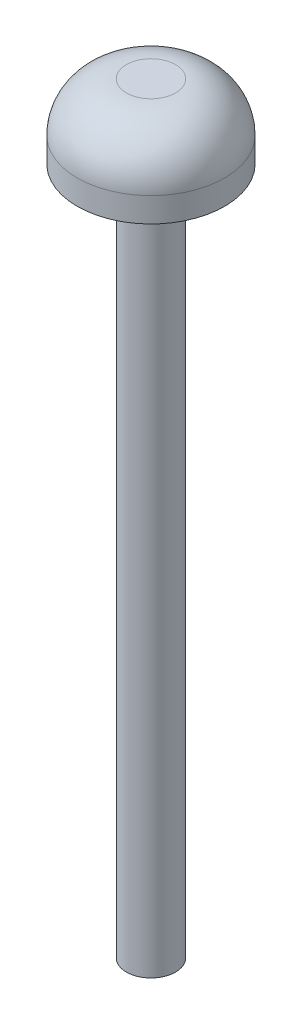
ISO-10303-21;
HEADER;
FILE_DESCRIPTION(('STEP AP214'),'2;1');
FILE_NAME('part.step','',(''),(''),'','','');
FILE_SCHEMA(('AUTOMOTIVE_DESIGN { 1 0 10303 214 1 1 1 1 }'));
ENDSEC;
DATA;
#1=APPLICATION_CONTEXT('core data for automotive mechanical design processes');
#2=APPLICATION_PROTOCOL_DEFINITION('international standard','automotive_design',2000,#1);
#3=PRODUCT_CONTEXT('',#1,'mechanical');
#4=PRODUCT('Part','Part','',(#3));
#5=PRODUCT_RELATED_PRODUCT_CATEGORY('part','',(#4));
#6=PRODUCT_DEFINITION_FORMATION('','',#4);
#7=PRODUCT_DEFINITION_CONTEXT('part definition',#1,'design');
#8=PRODUCT_DEFINITION('design','',#6,#7);
#9=PRODUCT_DEFINITION_SHAPE('','',#8);
#10=(LENGTH_UNIT() NAMED_UNIT(*) SI_UNIT(.MILLI.,.METRE.));
#11=(NAMED_UNIT(*) PLANE_ANGLE_UNIT() SI_UNIT($,.RADIAN.));
#12=(NAMED_UNIT(*) SI_UNIT($,.STERADIAN.) SOLID_ANGLE_UNIT());
#13=UNCERTAINTY_MEASURE_WITH_UNIT(LENGTH_MEASURE(1.E-05),#10,'distance_accuracy_value','');
#14=(GEOMETRIC_REPRESENTATION_CONTEXT(3) GLOBAL_UNCERTAINTY_ASSIGNED_CONTEXT((#13)) GLOBAL_UNIT_ASSIGNED_CONTEXT((#10,
#11,#12)) REPRESENTATION_CONTEXT('',''));
#15=CARTESIAN_POINT('',(0.,0.,0.));
#16=DIRECTION('',(0.,0.,1.));
#17=DIRECTION('',(1.,0.,0.));
#18=AXIS2_PLACEMENT_3D('',#15,#16,#17);
#19=CARTESIAN_POINT('',(0.,14.,0.));
#20=DIRECTION('',(0.,-1.,0.));
#21=DIRECTION('',(0.,0.,-1.));
#22=AXIS2_PLACEMENT_3D('',#19,#20,#21);
#23=CYLINDRICAL_SURFACE('',#22,0.5);
#24=CARTESIAN_POINT('',(0.,14.,0.));
#25=DIRECTION('',(0.,1.,0.));
#26=DIRECTION('',(0.,0.,1.));
#27=AXIS2_PLACEMENT_3D('',#24,#25,#26);
#28=CIRCLE('',#27,0.5);
#29=CARTESIAN_POINT('',(0.,14.,0.5));
#30=VERTEX_POINT('',#29);
#31=EDGE_CURVE('E59',#30,#30,#28,.T.);
#32=ORIENTED_EDGE('',*,*,#31,.F.);
#33=EDGE_LOOP('',(#32));
#34=FACE_BOUND('',#33,.T.);
#35=CARTESIAN_POINT('',(0.,0.,0.));
#36=DIRECTION('',(0.,1.,0.));
#37=DIRECTION('',(0.,0.,1.));
#38=AXIS2_PLACEMENT_3D('',#35,#36,#37);
#39=CIRCLE('',#38,0.5);
#40=CARTESIAN_POINT('',(0.,0.,0.5));
#41=VERTEX_POINT('',#40);
#42=EDGE_CURVE('E65',#41,#41,#39,.T.);
#43=ORIENTED_EDGE('',*,*,#42,.T.);
#44=EDGE_LOOP('',(#43));
#45=FACE_BOUND('',#44,.T.);
#46=ADVANCED_FACE('F44',(#34,#45),#23,.T.);
#47=CARTESIAN_POINT('',(0.,0.,0.));
#48=DIRECTION('',(0.,1.,0.));
#49=DIRECTION('',(0.,0.,1.));
#50=AXIS2_PLACEMENT_3D('',#47,#48,#49);
#51=PLANE('',#50);
#52=ORIENTED_EDGE('',*,*,#42,.F.);
#53=EDGE_LOOP('',(#52));
#54=FACE_BOUND('',#53,.T.);
#55=ADVANCED_FACE('F93',(#54),#51,.F.);
#56=CARTESIAN_POINT('',(0.,15.5,0.));
#57=DIRECTION('',(0.,-1.,0.));
#58=DIRECTION('',(0.,0.,-1.));
#59=AXIS2_PLACEMENT_3D('',#56,#57,#58);
#60=CYLINDRICAL_SURFACE('',#59,1.5);
#61=CARTESIAN_POINT('',(0.,14.5,0.));
#62=DIRECTION('',(0.,1.,0.));
#63=DIRECTION('',(0.,0.,1.));
#64=AXIS2_PLACEMENT_3D('',#61,#62,#63);
#65=CIRCLE('',#64,1.5);
#66=CARTESIAN_POINT('',(0.,14.5,1.5));
#67=VERTEX_POINT('',#66);
#68=EDGE_CURVE('E10',#67,#67,#65,.F.);
#69=ORIENTED_EDGE('',*,*,#68,.T.);
#70=EDGE_LOOP('',(#69));
#71=FACE_BOUND('',#70,.T.);
#72=CARTESIAN_POINT('',(0.,14.,0.));
#73=DIRECTION('',(0.,1.,0.));
#74=DIRECTION('',(0.,0.,1.));
#75=AXIS2_PLACEMENT_3D('',#72,#73,#74);
#76=CIRCLE('',#75,1.5);
#77=CARTESIAN_POINT('',(0.,14.,1.5));
#78=VERTEX_POINT('',#77);
#79=EDGE_CURVE('E70',#78,#78,#76,.T.);
#80=ORIENTED_EDGE('',*,*,#79,.T.);
#81=EDGE_LOOP('',(#80));
#82=FACE_BOUND('',#81,.T.);
#83=ADVANCED_FACE('F74',(#71,#82),#60,.T.);
#84=CARTESIAN_POINT('',(0.,15.5,0.));
#85=DIRECTION('',(0.,1.,0.));
#86=DIRECTION('',(0.,0.,1.));
#87=AXIS2_PLACEMENT_3D('',#84,#85,#86);
#88=PLANE('',#87);
#89=CARTESIAN_POINT('',(0.,15.5,0.));
#90=DIRECTION('',(0.,1.,0.));
#91=DIRECTION('',(0.,0.,1.));
#92=AXIS2_PLACEMENT_3D('',#89,#90,#91);
#93=CIRCLE('',#92,0.5);
#94=CARTESIAN_POINT('',(0.,15.5,0.5));
#95=VERTEX_POINT('',#94);
#96=EDGE_CURVE('E52',#95,#95,#93,.T.);
#97=ORIENTED_EDGE('',*,*,#96,.T.);
#98=EDGE_LOOP('',(#97));
#99=FACE_BOUND('',#98,.T.);
#100=ADVANCED_FACE('F80',(#99),#88,.T.);
#101=CARTESIAN_POINT('',(0.,14.,0.));
#102=DIRECTION('',(0.,1.,0.));
#103=DIRECTION('',(0.,0.,1.));
#104=AXIS2_PLACEMENT_3D('',#101,#102,#103);
#105=PLANE('',#104);
#106=ORIENTED_EDGE('',*,*,#31,.T.);
#107=EDGE_LOOP('',(#106));
#108=FACE_BOUND('',#107,.T.);
#109=ORIENTED_EDGE('',*,*,#79,.F.);
#110=EDGE_LOOP('',(#109));
#111=FACE_BOUND('',#110,.T.);
#112=ADVANCED_FACE('F79',(#108,#111),#105,.F.);
#113=CARTESIAN_POINT('',(0.,14.5,0.));
#114=DIRECTION('',(0.,1.,0.));
#115=DIRECTION('',(0.,0.,1.));
#116=AXIS2_PLACEMENT_3D('',#113,#114,#115);
#117=DEGENERATE_TOROIDAL_SURFACE('',#116,0.5,1.,.T.);
#118=ORIENTED_EDGE('',*,*,#68,.F.);
#119=EDGE_LOOP('',(#118));
#120=FACE_BOUND('',#119,.T.);
#121=ORIENTED_EDGE('',*,*,#96,.F.);
#122=EDGE_LOOP('',(#121));
#123=FACE_BOUND('',#122,.T.);
#124=ADVANCED_FACE('F50',(#120,#123),#117,.T.);
#125=CLOSED_SHELL('',(#46,#55,#83,#100,#112,#124));
#126=MANIFOLD_SOLID_BREP('B2',#125);
#127=ADVANCED_BREP_SHAPE_REPRESENTATION('',(#18,#126),#14);
#128=SHAPE_DEFINITION_REPRESENTATION(#9,#127);
ENDSEC;
END-ISO-10303-21;
